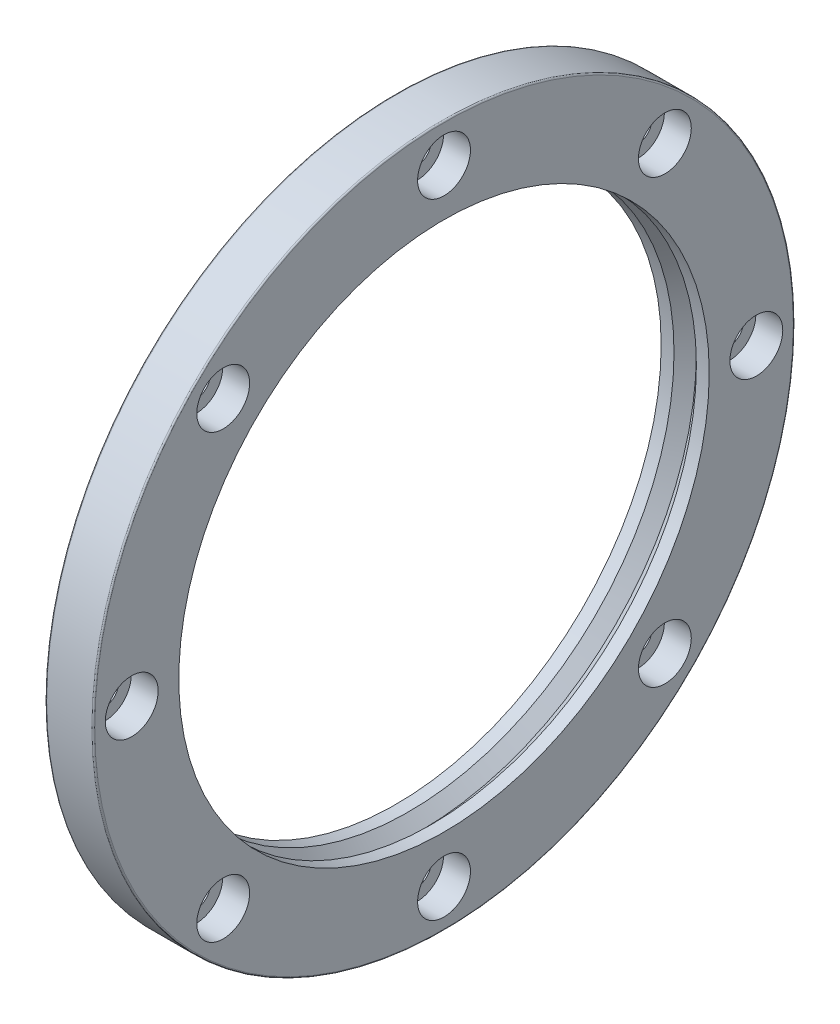
ISO-10303-21;
HEADER;
FILE_DESCRIPTION(('STEP AP214'),'2;1');
FILE_NAME('part.step','',(''),(''),'','','');
FILE_SCHEMA(('AUTOMOTIVE_DESIGN { 1 0 10303 214 1 1 1 1 }'));
ENDSEC;
DATA;
#1=APPLICATION_CONTEXT('core data for automotive mechanical design processes');
#2=APPLICATION_PROTOCOL_DEFINITION('international standard','automotive_design',2000,#1);
#3=PRODUCT_CONTEXT('',#1,'mechanical');
#4=PRODUCT('Part','Part','',(#3));
#5=PRODUCT_RELATED_PRODUCT_CATEGORY('part','',(#4));
#6=PRODUCT_DEFINITION_FORMATION('','',#4);
#7=PRODUCT_DEFINITION_CONTEXT('part definition',#1,'design');
#8=PRODUCT_DEFINITION('design','',#6,#7);
#9=PRODUCT_DEFINITION_SHAPE('','',#8);
#10=(LENGTH_UNIT() NAMED_UNIT(*) SI_UNIT(.MILLI.,.METRE.));
#11=(NAMED_UNIT(*) PLANE_ANGLE_UNIT() SI_UNIT($,.RADIAN.));
#12=(NAMED_UNIT(*) SI_UNIT($,.STERADIAN.) SOLID_ANGLE_UNIT());
#13=UNCERTAINTY_MEASURE_WITH_UNIT(LENGTH_MEASURE(1.E-05),#10,'distance_accuracy_value','');
#14=(GEOMETRIC_REPRESENTATION_CONTEXT(3) GLOBAL_UNCERTAINTY_ASSIGNED_CONTEXT((#13)) GLOBAL_UNIT_ASSIGNED_CONTEXT((#10,
#11,#12)) REPRESENTATION_CONTEXT('',''));
#15=CARTESIAN_POINT('',(0.,0.,0.));
#16=DIRECTION('',(0.,0.,1.));
#17=DIRECTION('',(1.,0.,0.));
#18=AXIS2_PLACEMENT_3D('',#15,#16,#17);
#19=CARTESIAN_POINT('',(5.,0.,0.));
#20=DIRECTION('',(1.,0.,0.));
#21=DIRECTION('',(0.,0.,-1.));
#22=AXIS2_PLACEMENT_3D('',#19,#20,#21);
#23=CYLINDRICAL_SURFACE('',#22,27.6);
#24=CARTESIAN_POINT('',(1.33578643762692,0.,0.));
#25=DIRECTION('',(-1.,0.,0.));
#26=DIRECTION('',(0.,0.,-1.));
#27=AXIS2_PLACEMENT_3D('',#24,#25,#26);
#28=CIRCLE('',#27,27.6);
#29=CARTESIAN_POINT('',(1.33578643762692,0.,-27.6));
#30=VERTEX_POINT('',#29);
#31=EDGE_CURVE('E143',#30,#30,#28,.T.);
#32=ORIENTED_EDGE('',*,*,#31,.F.);
#33=EDGE_LOOP('',(#32));
#34=FACE_BOUND('',#33,.T.);
#35=CARTESIAN_POINT('',(0.,0.,0.));
#36=DIRECTION('',(1.,0.,0.));
#37=DIRECTION('',(0.,0.,-1.));
#38=AXIS2_PLACEMENT_3D('',#35,#36,#37);
#39=CIRCLE('',#38,27.6);
#40=CARTESIAN_POINT('',(0.,0.,-27.6));
#41=VERTEX_POINT('',#40);
#42=EDGE_CURVE('E140',#41,#41,#39,.T.);
#43=ORIENTED_EDGE('',*,*,#42,.F.);
#44=EDGE_LOOP('',(#43));
#45=FACE_BOUND('',#44,.T.);
#46=ADVANCED_FACE('F15',(#34,#45),#23,.F.);
#47=CARTESIAN_POINT('',(0.,36.35,0.));
#48=DIRECTION('',(-1.,0.,0.));
#49=DIRECTION('',(0.,0.,1.));
#50=AXIS2_PLACEMENT_3D('',#47,#48,#49);
#51=PLANE('',#50);
#52=CARTESIAN_POINT('',(0.,0.,32.5));
#53=DIRECTION('',(1.,0.,0.));
#54=DIRECTION('',(0.,0.,-1.));
#55=AXIS2_PLACEMENT_3D('',#52,#53,#54);
#56=CIRCLE('',#55,1.45);
#57=CARTESIAN_POINT('',(0.,0.,31.05));
#58=VERTEX_POINT('',#57);
#59=EDGE_CURVE('E137',#58,#58,#56,.T.);
#60=ORIENTED_EDGE('',*,*,#59,.T.);
#61=EDGE_LOOP('',(#60));
#62=FACE_BOUND('',#61,.T.);
#63=CARTESIAN_POINT('',(0.,-22.980970388563,22.980970388563));
#64=DIRECTION('',(1.,0.,0.));
#65=DIRECTION('',(0.,0.,-1.));
#66=AXIS2_PLACEMENT_3D('',#63,#64,#65);
#67=CIRCLE('',#66,1.45);
#68=CARTESIAN_POINT('',(0.,-22.980970388563,21.530970388563));
#69=VERTEX_POINT('',#68);
#70=EDGE_CURVE('E134',#69,#69,#67,.T.);
#71=ORIENTED_EDGE('',*,*,#70,.T.);
#72=EDGE_LOOP('',(#71));
#73=FACE_BOUND('',#72,.T.);
#74=CARTESIAN_POINT('',(0.,-32.5,0.));
#75=DIRECTION('',(1.,0.,0.));
#76=DIRECTION('',(0.,0.,-1.));
#77=AXIS2_PLACEMENT_3D('',#74,#75,#76);
#78=CIRCLE('',#77,1.45);
#79=CARTESIAN_POINT('',(0.,-32.5,-1.45));
#80=VERTEX_POINT('',#79);
#81=EDGE_CURVE('E131',#80,#80,#78,.T.);
#82=ORIENTED_EDGE('',*,*,#81,.T.);
#83=EDGE_LOOP('',(#82));
#84=FACE_BOUND('',#83,.T.);
#85=CARTESIAN_POINT('',(0.,-22.980970388563,-22.980970388563));
#86=DIRECTION('',(1.,0.,0.));
#87=DIRECTION('',(0.,0.,-1.));
#88=AXIS2_PLACEMENT_3D('',#85,#86,#87);
#89=CIRCLE('',#88,1.45);
#90=CARTESIAN_POINT('',(0.,-22.980970388563,-24.430970388563));
#91=VERTEX_POINT('',#90);
#92=EDGE_CURVE('E128',#91,#91,#89,.T.);
#93=ORIENTED_EDGE('',*,*,#92,.T.);
#94=EDGE_LOOP('',(#93));
#95=FACE_BOUND('',#94,.T.);
#96=CARTESIAN_POINT('',(0.,0.,-32.5));
#97=DIRECTION('',(1.,0.,0.));
#98=DIRECTION('',(0.,0.,-1.));
#99=AXIS2_PLACEMENT_3D('',#96,#97,#98);
#100=CIRCLE('',#99,1.45);
#101=CARTESIAN_POINT('',(0.,0.,-33.95));
#102=VERTEX_POINT('',#101);
#103=EDGE_CURVE('E125',#102,#102,#100,.T.);
#104=ORIENTED_EDGE('',*,*,#103,.T.);
#105=EDGE_LOOP('',(#104));
#106=FACE_BOUND('',#105,.T.);
#107=CARTESIAN_POINT('',(0.,22.980970388563,-22.980970388563));
#108=DIRECTION('',(1.,0.,0.));
#109=DIRECTION('',(0.,0.,-1.));
#110=AXIS2_PLACEMENT_3D('',#107,#108,#109);
#111=CIRCLE('',#110,1.45);
#112=CARTESIAN_POINT('',(0.,22.980970388563,-24.430970388563));
#113=VERTEX_POINT('',#112);
#114=EDGE_CURVE('E122',#113,#113,#111,.T.);
#115=ORIENTED_EDGE('',*,*,#114,.T.);
#116=EDGE_LOOP('',(#115));
#117=FACE_BOUND('',#116,.T.);
#118=CARTESIAN_POINT('',(0.,22.980970388563,22.980970388563));
#119=DIRECTION('',(1.,0.,0.));
#120=DIRECTION('',(0.,0.,-1.));
#121=AXIS2_PLACEMENT_3D('',#118,#119,#120);
#122=CIRCLE('',#121,1.45);
#123=CARTESIAN_POINT('',(0.,22.980970388563,21.530970388563));
#124=VERTEX_POINT('',#123);
#125=EDGE_CURVE('E119',#124,#124,#122,.T.);
#126=ORIENTED_EDGE('',*,*,#125,.T.);
#127=EDGE_LOOP('',(#126));
#128=FACE_BOUND('',#127,.T.);
#129=CARTESIAN_POINT('',(0.,32.5,0.));
#130=DIRECTION('',(1.,0.,0.));
#131=DIRECTION('',(0.,0.,-1.));
#132=AXIS2_PLACEMENT_3D('',#129,#130,#131);
#133=CIRCLE('',#132,1.45);
#134=CARTESIAN_POINT('',(0.,32.5,-1.45));
#135=VERTEX_POINT('',#134);
#136=EDGE_CURVE('E116',#135,#135,#133,.T.);
#137=ORIENTED_EDGE('',*,*,#136,.T.);
#138=EDGE_LOOP('',(#137));
#139=FACE_BOUND('',#138,.T.);
#140=ORIENTED_EDGE('',*,*,#42,.T.);
#141=EDGE_LOOP('',(#140));
#142=FACE_BOUND('',#141,.T.);
#143=CARTESIAN_POINT('',(0.,0.,0.));
#144=DIRECTION('',(1.,0.,0.));
#145=DIRECTION('',(0.,0.,-1.));
#146=AXIS2_PLACEMENT_3D('',#143,#144,#145);
#147=CIRCLE('',#146,36.349999991941);
#148=CARTESIAN_POINT('',(0.,0.,-36.349999991941));
#149=VERTEX_POINT('',#148);
#150=EDGE_CURVE('E113',#149,#149,#147,.T.);
#151=ORIENTED_EDGE('',*,*,#150,.F.);
#152=EDGE_LOOP('',(#151));
#153=FACE_BOUND('',#152,.T.);
#154=ADVANCED_FACE('F152',(#62,#73,#84,#95,#106,#117,#128,#139,#142,#153),#51,.T.);
#155=CARTESIAN_POINT('',(3.66421356237308,0.,0.));
#156=DIRECTION('',(1.,0.,0.));
#157=DIRECTION('',(0.,0.,1.));
#158=AXIS2_PLACEMENT_3D('',#155,#156,#157);
#159=CIRCLE('',#158,27.6);
#160=CARTESIAN_POINT('',(3.66421356237308,0.,27.6));
#161=VERTEX_POINT('',#160);
#162=EDGE_CURVE('E110',#161,#161,#159,.T.);
#163=ORIENTED_EDGE('',*,*,#162,.F.);
#164=EDGE_LOOP('',(#163));
#165=FACE_BOUND('',#164,.T.);
#166=CARTESIAN_POINT('',(5.,0.,0.));
#167=DIRECTION('',(1.,0.,0.));
#168=DIRECTION('',(0.,0.,-1.));
#169=AXIS2_PLACEMENT_3D('',#166,#167,#168);
#170=CIRCLE('',#169,27.6);
#171=CARTESIAN_POINT('',(5.,0.,-27.6));
#172=VERTEX_POINT('',#171);
#173=EDGE_CURVE('E107',#172,#172,#170,.T.);
#174=ORIENTED_EDGE('',*,*,#173,.T.);
#175=EDGE_LOOP('',(#174));
#176=FACE_BOUND('',#175,.T.);
#177=ADVANCED_FACE('F154',(#165,#176),#23,.F.);
#178=CARTESIAN_POINT('',(5.,27.6,0.));
#179=DIRECTION('',(1.,0.,0.));
#180=DIRECTION('',(0.,0.,-1.));
#181=AXIS2_PLACEMENT_3D('',#178,#179,#180);
#182=PLANE('',#181);
#183=CARTESIAN_POINT('',(5.,0.,32.5));
#184=DIRECTION('',(1.,0.,0.));
#185=DIRECTION('',(0.,0.,-1.));
#186=AXIS2_PLACEMENT_3D('',#183,#184,#185);
#187=CIRCLE('',#186,2.75);
#188=CARTESIAN_POINT('',(5.,0.,29.75));
#189=VERTEX_POINT('',#188);
#190=EDGE_CURVE('E104',#189,#189,#187,.T.);
#191=ORIENTED_EDGE('',*,*,#190,.F.);
#192=EDGE_LOOP('',(#191));
#193=FACE_BOUND('',#192,.T.);
#194=CARTESIAN_POINT('',(5.,-22.980970388563,22.980970388563));
#195=DIRECTION('',(1.,0.,0.));
#196=DIRECTION('',(0.,0.,-1.));
#197=AXIS2_PLACEMENT_3D('',#194,#195,#196);
#198=CIRCLE('',#197,2.75);
#199=CARTESIAN_POINT('',(5.,-22.980970388563,20.230970388563));
#200=VERTEX_POINT('',#199);
#201=EDGE_CURVE('E101',#200,#200,#198,.T.);
#202=ORIENTED_EDGE('',*,*,#201,.F.);
#203=EDGE_LOOP('',(#202));
#204=FACE_BOUND('',#203,.T.);
#205=CARTESIAN_POINT('',(5.,-32.5,0.));
#206=DIRECTION('',(1.,0.,0.));
#207=DIRECTION('',(0.,0.,-1.));
#208=AXIS2_PLACEMENT_3D('',#205,#206,#207);
#209=CIRCLE('',#208,2.75);
#210=CARTESIAN_POINT('',(5.,-32.5,-2.75));
#211=VERTEX_POINT('',#210);
#212=EDGE_CURVE('E98',#211,#211,#209,.T.);
#213=ORIENTED_EDGE('',*,*,#212,.F.);
#214=EDGE_LOOP('',(#213));
#215=FACE_BOUND('',#214,.T.);
#216=CARTESIAN_POINT('',(5.,-22.980970388563,-22.980970388563));
#217=DIRECTION('',(1.,0.,0.));
#218=DIRECTION('',(0.,0.,-1.));
#219=AXIS2_PLACEMENT_3D('',#216,#217,#218);
#220=CIRCLE('',#219,2.75);
#221=CARTESIAN_POINT('',(5.,-22.980970388563,-25.730970388563));
#222=VERTEX_POINT('',#221);
#223=EDGE_CURVE('E95',#222,#222,#220,.T.);
#224=ORIENTED_EDGE('',*,*,#223,.F.);
#225=EDGE_LOOP('',(#224));
#226=FACE_BOUND('',#225,.T.);
#227=CARTESIAN_POINT('',(5.,0.,-32.5));
#228=DIRECTION('',(1.,0.,0.));
#229=DIRECTION('',(0.,0.,-1.));
#230=AXIS2_PLACEMENT_3D('',#227,#228,#229);
#231=CIRCLE('',#230,2.75);
#232=CARTESIAN_POINT('',(5.,0.,-35.25));
#233=VERTEX_POINT('',#232);
#234=EDGE_CURVE('E92',#233,#233,#231,.T.);
#235=ORIENTED_EDGE('',*,*,#234,.F.);
#236=EDGE_LOOP('',(#235));
#237=FACE_BOUND('',#236,.T.);
#238=CARTESIAN_POINT('',(5.,22.980970388563,-22.980970388563));
#239=DIRECTION('',(1.,0.,0.));
#240=DIRECTION('',(0.,0.,-1.));
#241=AXIS2_PLACEMENT_3D('',#238,#239,#240);
#242=CIRCLE('',#241,2.75);
#243=CARTESIAN_POINT('',(5.,22.980970388563,-25.730970388563));
#244=VERTEX_POINT('',#243);
#245=EDGE_CURVE('E89',#244,#244,#242,.T.);
#246=ORIENTED_EDGE('',*,*,#245,.F.);
#247=EDGE_LOOP('',(#246));
#248=FACE_BOUND('',#247,.T.);
#249=CARTESIAN_POINT('',(5.,22.980970388563,22.980970388563));
#250=DIRECTION('',(1.,0.,0.));
#251=DIRECTION('',(0.,0.,-1.));
#252=AXIS2_PLACEMENT_3D('',#249,#250,#251);
#253=CIRCLE('',#252,2.75);
#254=CARTESIAN_POINT('',(5.,22.980970388563,20.230970388563));
#255=VERTEX_POINT('',#254);
#256=EDGE_CURVE('E86',#255,#255,#253,.T.);
#257=ORIENTED_EDGE('',*,*,#256,.F.);
#258=EDGE_LOOP('',(#257));
#259=FACE_BOUND('',#258,.T.);
#260=CARTESIAN_POINT('',(5.,32.5,0.));
#261=DIRECTION('',(1.,0.,0.));
#262=DIRECTION('',(0.,0.,-1.));
#263=AXIS2_PLACEMENT_3D('',#260,#261,#262);
#264=CIRCLE('',#263,2.75);
#265=CARTESIAN_POINT('',(5.,32.5,-2.75));
#266=VERTEX_POINT('',#265);
#267=EDGE_CURVE('E83',#266,#266,#264,.T.);
#268=ORIENTED_EDGE('',*,*,#267,.F.);
#269=EDGE_LOOP('',(#268));
#270=FACE_BOUND('',#269,.T.);
#271=CARTESIAN_POINT('',(5.,0.,0.));
#272=DIRECTION('',(1.,0.,0.));
#273=DIRECTION('',(0.,0.,-1.));
#274=AXIS2_PLACEMENT_3D('',#271,#272,#273);
#275=CIRCLE('',#274,36.35);
#276=CARTESIAN_POINT('',(5.,0.,-36.35));
#277=VERTEX_POINT('',#276);
#278=EDGE_CURVE('E80',#277,#277,#275,.T.);
#279=ORIENTED_EDGE('',*,*,#278,.T.);
#280=EDGE_LOOP('',(#279));
#281=FACE_BOUND('',#280,.T.);
#282=ORIENTED_EDGE('',*,*,#173,.F.);
#283=EDGE_LOOP('',(#282));
#284=FACE_BOUND('',#283,.T.);
#285=ADVANCED_FACE('F178',(#193,#204,#215,#226,#237,#248,#259,#270,#281,#284),#182,.T.);
#286=CARTESIAN_POINT('',(4.85000000000007,0.,0.));
#287=DIRECTION('',(1.,0.,0.));
#288=DIRECTION('',(0.,0.,-1.));
#289=AXIS2_PLACEMENT_3D('',#286,#287,#288);
#290=TOROIDAL_SURFACE('',#289,36.35,0.149999999999926);
#291=CARTESIAN_POINT('',(4.85,0.,0.));
#292=DIRECTION('',(1.,0.,0.));
#293=DIRECTION('',(0.,0.,-1.));
#294=AXIS2_PLACEMENT_3D('',#291,#292,#293);
#295=CIRCLE('',#294,36.5);
#296=CARTESIAN_POINT('',(4.85,0.,-36.5));
#297=VERTEX_POINT('',#296);
#298=EDGE_CURVE('E77',#297,#297,#295,.T.);
#299=ORIENTED_EDGE('',*,*,#298,.T.);
#300=EDGE_LOOP('',(#299));
#301=FACE_BOUND('',#300,.T.);
#302=ORIENTED_EDGE('',*,*,#278,.F.);
#303=EDGE_LOOP('',(#302));
#304=FACE_BOUND('',#303,.T.);
#305=ADVANCED_FACE('F172',(#301,#304),#290,.T.);
#306=CARTESIAN_POINT('',(5.,0.,0.));
#307=DIRECTION('',(1.,0.,0.));
#308=DIRECTION('',(0.,0.,-1.));
#309=AXIS2_PLACEMENT_3D('',#306,#307,#308);
#310=CYLINDRICAL_SURFACE('',#309,36.5);
#311=CARTESIAN_POINT('',(0.15,0.,0.));
#312=DIRECTION('',(1.,0.,0.));
#313=DIRECTION('',(0.,0.,-1.));
#314=AXIS2_PLACEMENT_3D('',#311,#312,#313);
#315=CIRCLE('',#314,36.5);
#316=CARTESIAN_POINT('',(0.15,0.,-36.5));
#317=VERTEX_POINT('',#316);
#318=EDGE_CURVE('E74',#317,#317,#315,.T.);
#319=ORIENTED_EDGE('',*,*,#318,.T.);
#320=EDGE_LOOP('',(#319));
#321=FACE_BOUND('',#320,.T.);
#322=ORIENTED_EDGE('',*,*,#298,.F.);
#323=EDGE_LOOP('',(#322));
#324=FACE_BOUND('',#323,.T.);
#325=ADVANCED_FACE('F166',(#321,#324),#310,.T.);
#326=CARTESIAN_POINT('',(0.149999999999956,0.,0.));
#327=DIRECTION('',(1.,0.,0.));
#328=DIRECTION('',(0.,0.,-1.));
#329=AXIS2_PLACEMENT_3D('',#326,#327,#328);
#330=TOROIDAL_SURFACE('',#329,36.35,0.149999999999956);
#331=ORIENTED_EDGE('',*,*,#150,.T.);
#332=EDGE_LOOP('',(#331));
#333=FACE_BOUND('',#332,.T.);
#334=ORIENTED_EDGE('',*,*,#318,.F.);
#335=EDGE_LOOP('',(#334));
#336=FACE_BOUND('',#335,.T.);
#337=ADVANCED_FACE('F163',(#333,#336),#330,.T.);
#338=CARTESIAN_POINT('',(2.5,0.,0.));
#339=DIRECTION('',(1.,0.,0.));
#340=DIRECTION('',(0.,0.,-1.));
#341=AXIS2_PLACEMENT_3D('',#338,#339,#340);
#342=CONICAL_SURFACE('',#341,28.764213562373,0.785398163397412);
#343=ORIENTED_EDGE('',*,*,#31,.T.);
#344=EDGE_LOOP('',(#343));
#345=FACE_BOUND('',#344,.T.);
#346=CARTESIAN_POINT('',(2.5,0.,0.));
#347=DIRECTION('',(1.,0.,0.));
#348=DIRECTION('',(0.,0.,-1.));
#349=AXIS2_PLACEMENT_3D('',#346,#347,#348);
#350=CIRCLE('',#349,28.764213562373);
#351=CARTESIAN_POINT('',(2.5,0.,-28.764213562373));
#352=VERTEX_POINT('',#351);
#353=EDGE_CURVE('E71',#352,#352,#350,.T.);
#354=ORIENTED_EDGE('',*,*,#353,.T.);
#355=EDGE_LOOP('',(#354));
#356=FACE_BOUND('',#355,.T.);
#357=ADVANCED_FACE('F147',(#345,#356),#342,.F.);
#358=CARTESIAN_POINT('',(3.9142135623731,0.,0.));
#359=DIRECTION('',(-1.,0.,0.));
#360=DIRECTION('',(0.,0.,1.));
#361=AXIS2_PLACEMENT_3D('',#358,#359,#360);
#362=CONICAL_SURFACE('',#361,27.35,0.785398163397412);
#363=ORIENTED_EDGE('',*,*,#162,.T.);
#364=EDGE_LOOP('',(#363));
#365=FACE_BOUND('',#364,.T.);
#366=ORIENTED_EDGE('',*,*,#353,.F.);
#367=EDGE_LOOP('',(#366));
#368=FACE_BOUND('',#367,.T.);
#369=ADVANCED_FACE('F197',(#365,#368),#362,.F.);
#370=CARTESIAN_POINT('',(5.,32.5,0.));
#371=DIRECTION('',(1.,0.,0.));
#372=DIRECTION('',(0.,0.,-1.));
#373=AXIS2_PLACEMENT_3D('',#370,#371,#372);
#374=CYLINDRICAL_SURFACE('',#373,1.45);
#375=CARTESIAN_POINT('',(2.2,32.5,0.));
#376=DIRECTION('',(1.,0.,0.));
#377=DIRECTION('',(0.,0.,-1.));
#378=AXIS2_PLACEMENT_3D('',#375,#376,#377);
#379=CIRCLE('',#378,1.45);
#380=CARTESIAN_POINT('',(2.2,32.5,-1.45));
#381=VERTEX_POINT('',#380);
#382=EDGE_CURVE('E68',#381,#381,#379,.T.);
#383=ORIENTED_EDGE('',*,*,#382,.T.);
#384=EDGE_LOOP('',(#383));
#385=FACE_BOUND('',#384,.T.);
#386=ORIENTED_EDGE('',*,*,#136,.F.);
#387=EDGE_LOOP('',(#386));
#388=FACE_BOUND('',#387,.T.);
#389=ADVANCED_FACE('F200',(#385,#388),#374,.F.);
#390=CARTESIAN_POINT('',(2.2,33.95,0.));
#391=DIRECTION('',(1.,0.,0.));
#392=DIRECTION('',(0.,0.,-1.));
#393=AXIS2_PLACEMENT_3D('',#390,#391,#392);
#394=PLANE('',#393);
#395=CARTESIAN_POINT('',(2.2,32.5,0.));
#396=DIRECTION('',(1.,0.,0.));
#397=DIRECTION('',(0.,0.,-1.));
#398=AXIS2_PLACEMENT_3D('',#395,#396,#397);
#399=CIRCLE('',#398,2.75);
#400=CARTESIAN_POINT('',(2.2,32.5,-2.75));
#401=VERTEX_POINT('',#400);
#402=EDGE_CURVE('E65',#401,#401,#399,.T.);
#403=ORIENTED_EDGE('',*,*,#402,.T.);
#404=EDGE_LOOP('',(#403));
#405=FACE_BOUND('',#404,.T.);
#406=ORIENTED_EDGE('',*,*,#382,.F.);
#407=EDGE_LOOP('',(#406));
#408=FACE_BOUND('',#407,.T.);
#409=ADVANCED_FACE('F204',(#405,#408),#394,.T.);
#410=CARTESIAN_POINT('',(5.,32.5,0.));
#411=DIRECTION('',(1.,0.,0.));
#412=DIRECTION('',(0.,0.,-1.));
#413=AXIS2_PLACEMENT_3D('',#410,#411,#412);
#414=CYLINDRICAL_SURFACE('',#413,2.75);
#415=ORIENTED_EDGE('',*,*,#267,.T.);
#416=EDGE_LOOP('',(#415));
#417=FACE_BOUND('',#416,.T.);
#418=ORIENTED_EDGE('',*,*,#402,.F.);
#419=EDGE_LOOP('',(#418));
#420=FACE_BOUND('',#419,.T.);
#421=ADVANCED_FACE('F208',(#417,#420),#414,.F.);
#422=CARTESIAN_POINT('',(5.,22.980970388563,22.980970388563));
#423=DIRECTION('',(1.,0.,0.));
#424=DIRECTION('',(0.,0.,-1.));
#425=AXIS2_PLACEMENT_3D('',#422,#423,#424);
#426=CYLINDRICAL_SURFACE('',#425,1.45);
#427=CARTESIAN_POINT('',(2.2,22.980970388563,22.980970388563));
#428=DIRECTION('',(1.,0.,0.));
#429=DIRECTION('',(0.,0.,-1.));
#430=AXIS2_PLACEMENT_3D('',#427,#428,#429);
#431=CIRCLE('',#430,1.45);
#432=CARTESIAN_POINT('',(2.2,22.980970388563,21.530970388563));
#433=VERTEX_POINT('',#432);
#434=EDGE_CURVE('E62',#433,#433,#431,.T.);
#435=ORIENTED_EDGE('',*,*,#434,.T.);
#436=EDGE_LOOP('',(#435));
#437=FACE_BOUND('',#436,.T.);
#438=ORIENTED_EDGE('',*,*,#125,.F.);
#439=EDGE_LOOP('',(#438));
#440=FACE_BOUND('',#439,.T.);
#441=ADVANCED_FACE('F212',(#437,#440),#426,.F.);
#442=CARTESIAN_POINT('',(2.2,24.430970388563,22.980970388563));
#443=DIRECTION('',(1.,0.,0.));
#444=DIRECTION('',(0.,0.,-1.));
#445=AXIS2_PLACEMENT_3D('',#442,#443,#444);
#446=PLANE('',#445);
#447=CARTESIAN_POINT('',(2.2,22.980970388563,22.980970388563));
#448=DIRECTION('',(1.,0.,0.));
#449=DIRECTION('',(0.,0.,-1.));
#450=AXIS2_PLACEMENT_3D('',#447,#448,#449);
#451=CIRCLE('',#450,2.75);
#452=CARTESIAN_POINT('',(2.2,22.980970388563,20.230970388563));
#453=VERTEX_POINT('',#452);
#454=EDGE_CURVE('E59',#453,#453,#451,.T.);
#455=ORIENTED_EDGE('',*,*,#454,.T.);
#456=EDGE_LOOP('',(#455));
#457=FACE_BOUND('',#456,.T.);
#458=ORIENTED_EDGE('',*,*,#434,.F.);
#459=EDGE_LOOP('',(#458));
#460=FACE_BOUND('',#459,.T.);
#461=ADVANCED_FACE('F216',(#457,#460),#446,.T.);
#462=CARTESIAN_POINT('',(5.,22.980970388563,22.980970388563));
#463=DIRECTION('',(1.,0.,0.));
#464=DIRECTION('',(0.,0.,-1.));
#465=AXIS2_PLACEMENT_3D('',#462,#463,#464);
#466=CYLINDRICAL_SURFACE('',#465,2.75);
#467=ORIENTED_EDGE('',*,*,#256,.T.);
#468=EDGE_LOOP('',(#467));
#469=FACE_BOUND('',#468,.T.);
#470=ORIENTED_EDGE('',*,*,#454,.F.);
#471=EDGE_LOOP('',(#470));
#472=FACE_BOUND('',#471,.T.);
#473=ADVANCED_FACE('F220',(#469,#472),#466,.F.);
#474=CARTESIAN_POINT('',(5.,22.980970388563,-22.980970388563));
#475=DIRECTION('',(1.,0.,0.));
#476=DIRECTION('',(0.,0.,-1.));
#477=AXIS2_PLACEMENT_3D('',#474,#475,#476);
#478=CYLINDRICAL_SURFACE('',#477,1.45);
#479=CARTESIAN_POINT('',(2.2,22.980970388563,-22.980970388563));
#480=DIRECTION('',(1.,0.,0.));
#481=DIRECTION('',(0.,0.,-1.));
#482=AXIS2_PLACEMENT_3D('',#479,#480,#481);
#483=CIRCLE('',#482,1.45);
#484=CARTESIAN_POINT('',(2.2,22.980970388563,-24.430970388563));
#485=VERTEX_POINT('',#484);
#486=EDGE_CURVE('E56',#485,#485,#483,.T.);
#487=ORIENTED_EDGE('',*,*,#486,.T.);
#488=EDGE_LOOP('',(#487));
#489=FACE_BOUND('',#488,.T.);
#490=ORIENTED_EDGE('',*,*,#114,.F.);
#491=EDGE_LOOP('',(#490));
#492=FACE_BOUND('',#491,.T.);
#493=ADVANCED_FACE('F224',(#489,#492),#478,.F.);
#494=CARTESIAN_POINT('',(2.2,24.430970388563,-22.980970388563));
#495=DIRECTION('',(1.,0.,0.));
#496=DIRECTION('',(0.,0.,-1.));
#497=AXIS2_PLACEMENT_3D('',#494,#495,#496);
#498=PLANE('',#497);
#499=CARTESIAN_POINT('',(2.2,22.980970388563,-22.980970388563));
#500=DIRECTION('',(1.,0.,0.));
#501=DIRECTION('',(0.,0.,-1.));
#502=AXIS2_PLACEMENT_3D('',#499,#500,#501);
#503=CIRCLE('',#502,2.75);
#504=CARTESIAN_POINT('',(2.2,22.980970388563,-25.730970388563));
#505=VERTEX_POINT('',#504);
#506=EDGE_CURVE('E53',#505,#505,#503,.T.);
#507=ORIENTED_EDGE('',*,*,#506,.T.);
#508=EDGE_LOOP('',(#507));
#509=FACE_BOUND('',#508,.T.);
#510=ORIENTED_EDGE('',*,*,#486,.F.);
#511=EDGE_LOOP('',(#510));
#512=FACE_BOUND('',#511,.T.);
#513=ADVANCED_FACE('F228',(#509,#512),#498,.T.);
#514=CARTESIAN_POINT('',(5.,22.980970388563,-22.980970388563));
#515=DIRECTION('',(1.,0.,0.));
#516=DIRECTION('',(0.,0.,-1.));
#517=AXIS2_PLACEMENT_3D('',#514,#515,#516);
#518=CYLINDRICAL_SURFACE('',#517,2.75);
#519=ORIENTED_EDGE('',*,*,#245,.T.);
#520=EDGE_LOOP('',(#519));
#521=FACE_BOUND('',#520,.T.);
#522=ORIENTED_EDGE('',*,*,#506,.F.);
#523=EDGE_LOOP('',(#522));
#524=FACE_BOUND('',#523,.T.);
#525=ADVANCED_FACE('F232',(#521,#524),#518,.F.);
#526=CARTESIAN_POINT('',(5.,0.,-32.5));
#527=DIRECTION('',(1.,0.,0.));
#528=DIRECTION('',(0.,0.,-1.));
#529=AXIS2_PLACEMENT_3D('',#526,#527,#528);
#530=CYLINDRICAL_SURFACE('',#529,1.45);
#531=CARTESIAN_POINT('',(2.2,0.,-32.5));
#532=DIRECTION('',(1.,0.,0.));
#533=DIRECTION('',(0.,0.,-1.));
#534=AXIS2_PLACEMENT_3D('',#531,#532,#533);
#535=CIRCLE('',#534,1.45);
#536=CARTESIAN_POINT('',(2.2,0.,-33.95));
#537=VERTEX_POINT('',#536);
#538=EDGE_CURVE('E50',#537,#537,#535,.T.);
#539=ORIENTED_EDGE('',*,*,#538,.T.);
#540=EDGE_LOOP('',(#539));
#541=FACE_BOUND('',#540,.T.);
#542=ORIENTED_EDGE('',*,*,#103,.F.);
#543=EDGE_LOOP('',(#542));
#544=FACE_BOUND('',#543,.T.);
#545=ADVANCED_FACE('F236',(#541,#544),#530,.F.);
#546=CARTESIAN_POINT('',(2.2,1.45,-32.5));
#547=DIRECTION('',(1.,0.,0.));
#548=DIRECTION('',(0.,0.,-1.));
#549=AXIS2_PLACEMENT_3D('',#546,#547,#548);
#550=PLANE('',#549);
#551=CARTESIAN_POINT('',(2.2,0.,-32.5));
#552=DIRECTION('',(1.,0.,0.));
#553=DIRECTION('',(0.,0.,-1.));
#554=AXIS2_PLACEMENT_3D('',#551,#552,#553);
#555=CIRCLE('',#554,2.75);
#556=CARTESIAN_POINT('',(2.2,0.,-35.25));
#557=VERTEX_POINT('',#556);
#558=EDGE_CURVE('E47',#557,#557,#555,.T.);
#559=ORIENTED_EDGE('',*,*,#558,.T.);
#560=EDGE_LOOP('',(#559));
#561=FACE_BOUND('',#560,.T.);
#562=ORIENTED_EDGE('',*,*,#538,.F.);
#563=EDGE_LOOP('',(#562));
#564=FACE_BOUND('',#563,.T.);
#565=ADVANCED_FACE('F240',(#561,#564),#550,.T.);
#566=CARTESIAN_POINT('',(5.,0.,-32.5));
#567=DIRECTION('',(1.,0.,0.));
#568=DIRECTION('',(0.,0.,-1.));
#569=AXIS2_PLACEMENT_3D('',#566,#567,#568);
#570=CYLINDRICAL_SURFACE('',#569,2.75);
#571=ORIENTED_EDGE('',*,*,#234,.T.);
#572=EDGE_LOOP('',(#571));
#573=FACE_BOUND('',#572,.T.);
#574=ORIENTED_EDGE('',*,*,#558,.F.);
#575=EDGE_LOOP('',(#574));
#576=FACE_BOUND('',#575,.T.);
#577=ADVANCED_FACE('F244',(#573,#576),#570,.F.);
#578=CARTESIAN_POINT('',(5.,-22.980970388563,-22.980970388563));
#579=DIRECTION('',(1.,0.,0.));
#580=DIRECTION('',(0.,0.,-1.));
#581=AXIS2_PLACEMENT_3D('',#578,#579,#580);
#582=CYLINDRICAL_SURFACE('',#581,1.45);
#583=CARTESIAN_POINT('',(2.2,-22.980970388563,-22.980970388563));
#584=DIRECTION('',(1.,0.,0.));
#585=DIRECTION('',(0.,0.,-1.));
#586=AXIS2_PLACEMENT_3D('',#583,#584,#585);
#587=CIRCLE('',#586,1.45);
#588=CARTESIAN_POINT('',(2.2,-22.980970388563,-24.430970388563));
#589=VERTEX_POINT('',#588);
#590=EDGE_CURVE('E44',#589,#589,#587,.T.);
#591=ORIENTED_EDGE('',*,*,#590,.T.);
#592=EDGE_LOOP('',(#591));
#593=FACE_BOUND('',#592,.T.);
#594=ORIENTED_EDGE('',*,*,#92,.F.);
#595=EDGE_LOOP('',(#594));
#596=FACE_BOUND('',#595,.T.);
#597=ADVANCED_FACE('F248',(#593,#596),#582,.F.);
#598=CARTESIAN_POINT('',(2.2,-21.530970388563,-22.980970388563));
#599=DIRECTION('',(1.,0.,0.));
#600=DIRECTION('',(0.,0.,-1.));
#601=AXIS2_PLACEMENT_3D('',#598,#599,#600);
#602=PLANE('',#601);
#603=CARTESIAN_POINT('',(2.2,-22.980970388563,-22.980970388563));
#604=DIRECTION('',(1.,0.,0.));
#605=DIRECTION('',(0.,0.,-1.));
#606=AXIS2_PLACEMENT_3D('',#603,#604,#605);
#607=CIRCLE('',#606,2.75);
#608=CARTESIAN_POINT('',(2.2,-22.980970388563,-25.730970388563));
#609=VERTEX_POINT('',#608);
#610=EDGE_CURVE('E41',#609,#609,#607,.T.);
#611=ORIENTED_EDGE('',*,*,#610,.T.);
#612=EDGE_LOOP('',(#611));
#613=FACE_BOUND('',#612,.T.);
#614=ORIENTED_EDGE('',*,*,#590,.F.);
#615=EDGE_LOOP('',(#614));
#616=FACE_BOUND('',#615,.T.);
#617=ADVANCED_FACE('F252',(#613,#616),#602,.T.);
#618=CARTESIAN_POINT('',(5.,-22.980970388563,-22.980970388563));
#619=DIRECTION('',(1.,0.,0.));
#620=DIRECTION('',(0.,0.,-1.));
#621=AXIS2_PLACEMENT_3D('',#618,#619,#620);
#622=CYLINDRICAL_SURFACE('',#621,2.75);
#623=ORIENTED_EDGE('',*,*,#223,.T.);
#624=EDGE_LOOP('',(#623));
#625=FACE_BOUND('',#624,.T.);
#626=ORIENTED_EDGE('',*,*,#610,.F.);
#627=EDGE_LOOP('',(#626));
#628=FACE_BOUND('',#627,.T.);
#629=ADVANCED_FACE('F256',(#625,#628),#622,.F.);
#630=CARTESIAN_POINT('',(5.,-32.5,0.));
#631=DIRECTION('',(1.,0.,0.));
#632=DIRECTION('',(0.,0.,-1.));
#633=AXIS2_PLACEMENT_3D('',#630,#631,#632);
#634=CYLINDRICAL_SURFACE('',#633,1.45);
#635=CARTESIAN_POINT('',(2.2,-32.5,0.));
#636=DIRECTION('',(1.,0.,0.));
#637=DIRECTION('',(0.,0.,-1.));
#638=AXIS2_PLACEMENT_3D('',#635,#636,#637);
#639=CIRCLE('',#638,1.45);
#640=CARTESIAN_POINT('',(2.2,-32.5,-1.45));
#641=VERTEX_POINT('',#640);
#642=EDGE_CURVE('E38',#641,#641,#639,.T.);
#643=ORIENTED_EDGE('',*,*,#642,.T.);
#644=EDGE_LOOP('',(#643));
#645=FACE_BOUND('',#644,.T.);
#646=ORIENTED_EDGE('',*,*,#81,.F.);
#647=EDGE_LOOP('',(#646));
#648=FACE_BOUND('',#647,.T.);
#649=ADVANCED_FACE('F260',(#645,#648),#634,.F.);
#650=CARTESIAN_POINT('',(2.2,-31.05,0.));
#651=DIRECTION('',(1.,0.,0.));
#652=DIRECTION('',(0.,0.,-1.));
#653=AXIS2_PLACEMENT_3D('',#650,#651,#652);
#654=PLANE('',#653);
#655=CARTESIAN_POINT('',(2.2,-32.5,0.));
#656=DIRECTION('',(1.,0.,0.));
#657=DIRECTION('',(0.,0.,-1.));
#658=AXIS2_PLACEMENT_3D('',#655,#656,#657);
#659=CIRCLE('',#658,2.75);
#660=CARTESIAN_POINT('',(2.2,-32.5,-2.75));
#661=VERTEX_POINT('',#660);
#662=EDGE_CURVE('E35',#661,#661,#659,.T.);
#663=ORIENTED_EDGE('',*,*,#662,.T.);
#664=EDGE_LOOP('',(#663));
#665=FACE_BOUND('',#664,.T.);
#666=ORIENTED_EDGE('',*,*,#642,.F.);
#667=EDGE_LOOP('',(#666));
#668=FACE_BOUND('',#667,.T.);
#669=ADVANCED_FACE('F264',(#665,#668),#654,.T.);
#670=CARTESIAN_POINT('',(5.,-32.5,0.));
#671=DIRECTION('',(1.,0.,0.));
#672=DIRECTION('',(0.,0.,-1.));
#673=AXIS2_PLACEMENT_3D('',#670,#671,#672);
#674=CYLINDRICAL_SURFACE('',#673,2.75);
#675=ORIENTED_EDGE('',*,*,#212,.T.);
#676=EDGE_LOOP('',(#675));
#677=FACE_BOUND('',#676,.T.);
#678=ORIENTED_EDGE('',*,*,#662,.F.);
#679=EDGE_LOOP('',(#678));
#680=FACE_BOUND('',#679,.T.);
#681=ADVANCED_FACE('F268',(#677,#680),#674,.F.);
#682=CARTESIAN_POINT('',(5.,-22.980970388563,22.980970388563));
#683=DIRECTION('',(1.,0.,0.));
#684=DIRECTION('',(0.,0.,-1.));
#685=AXIS2_PLACEMENT_3D('',#682,#683,#684);
#686=CYLINDRICAL_SURFACE('',#685,1.45);
#687=CARTESIAN_POINT('',(2.2,-22.980970388563,22.980970388563));
#688=DIRECTION('',(1.,0.,0.));
#689=DIRECTION('',(0.,0.,-1.));
#690=AXIS2_PLACEMENT_3D('',#687,#688,#689);
#691=CIRCLE('',#690,1.45);
#692=CARTESIAN_POINT('',(2.2,-22.980970388563,21.530970388563));
#693=VERTEX_POINT('',#692);
#694=EDGE_CURVE('E30',#693,#693,#691,.T.);
#695=ORIENTED_EDGE('',*,*,#694,.T.);
#696=EDGE_LOOP('',(#695));
#697=FACE_BOUND('',#696,.T.);
#698=ORIENTED_EDGE('',*,*,#70,.F.);
#699=EDGE_LOOP('',(#698));
#700=FACE_BOUND('',#699,.T.);
#701=ADVANCED_FACE('F272',(#697,#700),#686,.F.);
#702=CARTESIAN_POINT('',(2.2,-21.530970388563,22.980970388563));
#703=DIRECTION('',(1.,0.,0.));
#704=DIRECTION('',(0.,0.,-1.));
#705=AXIS2_PLACEMENT_3D('',#702,#703,#704);
#706=PLANE('',#705);
#707=CARTESIAN_POINT('',(2.2,-22.980970388563,22.980970388563));
#708=DIRECTION('',(1.,0.,0.));
#709=DIRECTION('',(0.,0.,-1.));
#710=AXIS2_PLACEMENT_3D('',#707,#708,#709);
#711=CIRCLE('',#710,2.75);
#712=CARTESIAN_POINT('',(2.2,-22.980970388563,20.230970388563));
#713=VERTEX_POINT('',#712);
#714=EDGE_CURVE('E26',#713,#713,#711,.T.);
#715=ORIENTED_EDGE('',*,*,#714,.T.);
#716=EDGE_LOOP('',(#715));
#717=FACE_BOUND('',#716,.T.);
#718=ORIENTED_EDGE('',*,*,#694,.F.);
#719=EDGE_LOOP('',(#718));
#720=FACE_BOUND('',#719,.T.);
#721=ADVANCED_FACE('F276',(#717,#720),#706,.T.);
#722=CARTESIAN_POINT('',(5.,-22.980970388563,22.980970388563));
#723=DIRECTION('',(1.,0.,0.));
#724=DIRECTION('',(0.,0.,-1.));
#725=AXIS2_PLACEMENT_3D('',#722,#723,#724);
#726=CYLINDRICAL_SURFACE('',#725,2.75);
#727=ORIENTED_EDGE('',*,*,#201,.T.);
#728=EDGE_LOOP('',(#727));
#729=FACE_BOUND('',#728,.T.);
#730=ORIENTED_EDGE('',*,*,#714,.F.);
#731=EDGE_LOOP('',(#730));
#732=FACE_BOUND('',#731,.T.);
#733=ADVANCED_FACE('F280',(#729,#732),#726,.F.);
#734=CARTESIAN_POINT('',(5.,0.,32.5));
#735=DIRECTION('',(1.,0.,0.));
#736=DIRECTION('',(0.,0.,-1.));
#737=AXIS2_PLACEMENT_3D('',#734,#735,#736);
#738=CYLINDRICAL_SURFACE('',#737,1.45);
#739=CARTESIAN_POINT('',(2.2,0.,32.5));
#740=DIRECTION('',(1.,0.,0.));
#741=DIRECTION('',(0.,0.,-1.));
#742=AXIS2_PLACEMENT_3D('',#739,#740,#741);
#743=CIRCLE('',#742,1.45);
#744=CARTESIAN_POINT('',(2.2,0.,31.05));
#745=VERTEX_POINT('',#744);
#746=EDGE_CURVE('E22',#745,#745,#743,.T.);
#747=ORIENTED_EDGE('',*,*,#746,.T.);
#748=EDGE_LOOP('',(#747));
#749=FACE_BOUND('',#748,.T.);
#750=ORIENTED_EDGE('',*,*,#59,.F.);
#751=EDGE_LOOP('',(#750));
#752=FACE_BOUND('',#751,.T.);
#753=ADVANCED_FACE('F284',(#749,#752),#738,.F.);
#754=CARTESIAN_POINT('',(2.2,1.45,32.5));
#755=DIRECTION('',(1.,0.,0.));
#756=DIRECTION('',(0.,0.,-1.));
#757=AXIS2_PLACEMENT_3D('',#754,#755,#756);
#758=PLANE('',#757);
#759=CARTESIAN_POINT('',(2.2,0.,32.5));
#760=DIRECTION('',(1.,0.,0.));
#761=DIRECTION('',(0.,0.,-1.));
#762=AXIS2_PLACEMENT_3D('',#759,#760,#761);
#763=CIRCLE('',#762,2.75);
#764=CARTESIAN_POINT('',(2.2,0.,29.75));
#765=VERTEX_POINT('',#764);
#766=EDGE_CURVE('E10',#765,#765,#763,.T.);
#767=ORIENTED_EDGE('',*,*,#766,.T.);
#768=EDGE_LOOP('',(#767));
#769=FACE_BOUND('',#768,.T.);
#770=ORIENTED_EDGE('',*,*,#746,.F.);
#771=EDGE_LOOP('',(#770));
#772=FACE_BOUND('',#771,.T.);
#773=ADVANCED_FACE('F287',(#769,#772),#758,.T.);
#774=CARTESIAN_POINT('',(5.,0.,32.5));
#775=DIRECTION('',(1.,0.,0.));
#776=DIRECTION('',(0.,0.,-1.));
#777=AXIS2_PLACEMENT_3D('',#774,#775,#776);
#778=CYLINDRICAL_SURFACE('',#777,2.75);
#779=ORIENTED_EDGE('',*,*,#190,.T.);
#780=EDGE_LOOP('',(#779));
#781=FACE_BOUND('',#780,.T.);
#782=ORIENTED_EDGE('',*,*,#766,.F.);
#783=EDGE_LOOP('',(#782));
#784=FACE_BOUND('',#783,.T.);
#785=ADVANCED_FACE('F17',(#781,#784),#778,.F.);
#786=CLOSED_SHELL('',(#46,#154,#177,#285,#305,#325,#337,#357,#369,#389,#409,#421,#441,#461,#473,
#493,#513,#525,#545,#565,#577,#597,#617,#629,#649,#669,#681,#701,#721,#733,#753,#773,#785));
#787=MANIFOLD_SOLID_BREP('B1',#786);
#788=ADVANCED_BREP_SHAPE_REPRESENTATION('',(#18,#787),#14);
#789=SHAPE_DEFINITION_REPRESENTATION(#9,#788);
ENDSEC;
END-ISO-10303-21;
